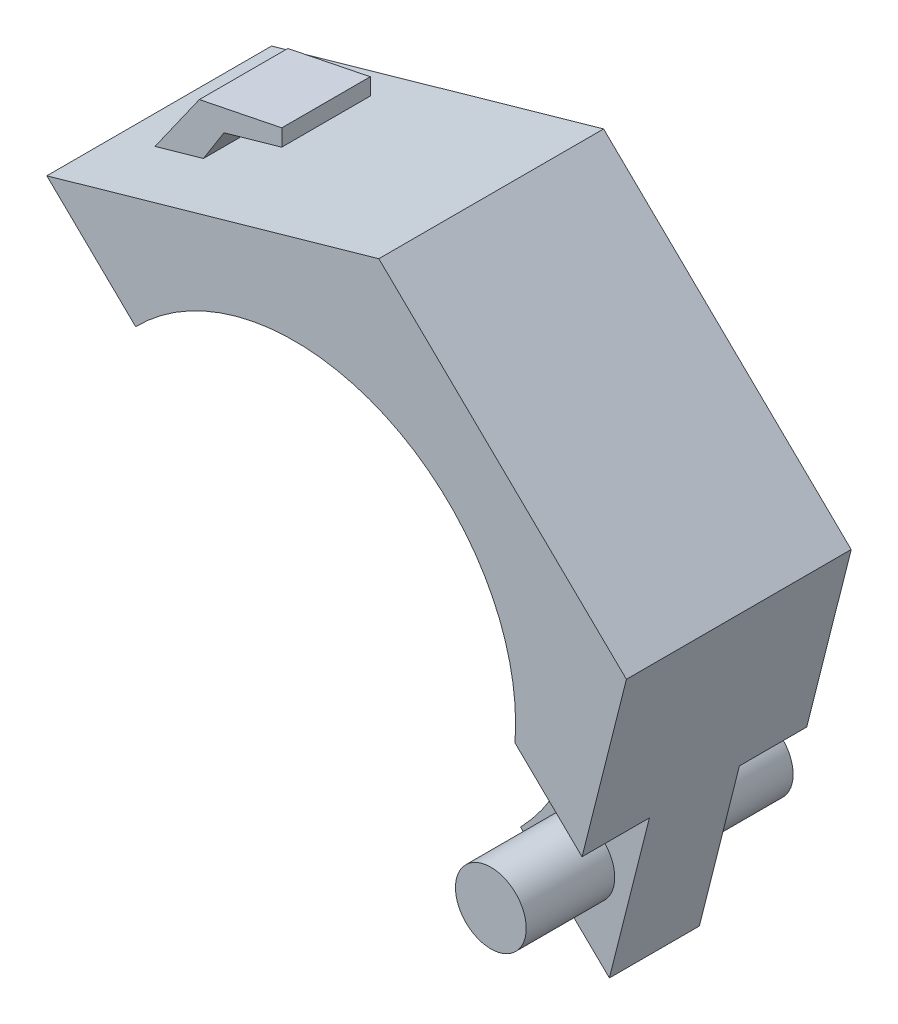
ISO-10303-21;
HEADER;
FILE_DESCRIPTION(('STEP AP214'),'2;1');
FILE_NAME('part.step','',(''),(''),'','','');
FILE_SCHEMA(('AUTOMOTIVE_DESIGN { 1 0 10303 214 1 1 1 1 }'));
ENDSEC;
DATA;
#1=APPLICATION_CONTEXT('core data for automotive mechanical design processes');
#2=APPLICATION_PROTOCOL_DEFINITION('international standard','automotive_design',2000,#1);
#3=PRODUCT_CONTEXT('',#1,'mechanical');
#4=PRODUCT('Part','Part','',(#3));
#5=PRODUCT_RELATED_PRODUCT_CATEGORY('part','',(#4));
#6=PRODUCT_DEFINITION_FORMATION('','',#4);
#7=PRODUCT_DEFINITION_CONTEXT('part definition',#1,'design');
#8=PRODUCT_DEFINITION('design','',#6,#7);
#9=PRODUCT_DEFINITION_SHAPE('','',#8);
#10=(LENGTH_UNIT() NAMED_UNIT(*) SI_UNIT(.MILLI.,.METRE.));
#11=(NAMED_UNIT(*) PLANE_ANGLE_UNIT() SI_UNIT($,.RADIAN.));
#12=(NAMED_UNIT(*) SI_UNIT($,.STERADIAN.) SOLID_ANGLE_UNIT());
#13=UNCERTAINTY_MEASURE_WITH_UNIT(LENGTH_MEASURE(1.E-05),#10,'distance_accuracy_value','');
#14=(GEOMETRIC_REPRESENTATION_CONTEXT(3) GLOBAL_UNCERTAINTY_ASSIGNED_CONTEXT((#13)) GLOBAL_UNIT_ASSIGNED_CONTEXT((#10,
#11,#12)) REPRESENTATION_CONTEXT('',''));
#15=CARTESIAN_POINT('',(0.,0.,0.));
#16=DIRECTION('',(0.,0.,1.));
#17=DIRECTION('',(1.,0.,0.));
#18=AXIS2_PLACEMENT_3D('',#15,#16,#17);
#19=CARTESIAN_POINT('',(-9.21847223963138,32.4926109995357,25.4));
#20=DIRECTION('',(0.272937816875296,-0.962031677295164,0.));
#21=DIRECTION('',(0.962031677295165,0.272937816875296,0.));
#22=AXIS2_PLACEMENT_3D('',#19,#20,#21);
#23=PLANE('',#22);
#24=DIRECTION('',(-0.962031677295164,-0.272937816875296,0.));
#25=VECTOR('',#24,1.);
#26=CARTESIAN_POINT('',(-9.21847223963138,32.4926109995357,0.));
#27=LINE('',#26,#25);
#28=CARTESIAN_POINT('',(9.54114546762431,37.8148984286039,0.));
#29=VERTEX_POINT('',#28);
#30=CARTESIAN_POINT('',(-27.9780899468871,27.1703235704674,0.));
#31=VERTEX_POINT('',#30);
#32=EDGE_CURVE('E228',#29,#31,#27,.T.);
#33=ORIENTED_EDGE('',*,*,#32,.T.);
#34=DIRECTION('',(0.,0.,-1.));
#35=VECTOR('',#34,1.);
#36=CARTESIAN_POINT('',(-27.9780899468871,27.1703235704674,25.4));
#37=LINE('',#36,#35);
#38=CARTESIAN_POINT('',(-27.9780899468871,27.1703235704674,25.4));
#39=VERTEX_POINT('',#38);
#40=EDGE_CURVE('E235',#39,#31,#37,.T.);
#41=ORIENTED_EDGE('',*,*,#40,.F.);
#42=DIRECTION('',(-0.962031677295164,-0.272937816875296,0.));
#43=VECTOR('',#42,1.);
#44=CARTESIAN_POINT('',(-9.21847223963138,32.4926109995357,25.4));
#45=LINE('',#44,#43);
#46=CARTESIAN_POINT('',(9.54114546762431,37.8148984286039,25.4));
#47=VERTEX_POINT('',#46);
#48=EDGE_CURVE('E219',#47,#39,#45,.T.);
#49=ORIENTED_EDGE('',*,*,#48,.F.);
#50=DIRECTION('',(0.,0.,-1.));
#51=VECTOR('',#50,1.);
#52=CARTESIAN_POINT('',(9.54114546762431,37.8148984286039,25.4));
#53=LINE('',#52,#51);
#54=EDGE_CURVE('E238',#47,#29,#53,.T.);
#55=ORIENTED_EDGE('',*,*,#54,.T.);
#56=EDGE_LOOP('',(#33,#41,#49,#55));
#57=FACE_BOUND('',#56,.T.);
#58=DIRECTION('',(-0.962031677295165,-0.272937816875296,0.));
#59=VECTOR('',#58,1.);
#60=CARTESIAN_POINT('',(-17.98380271377,30.0058008245024,7.7));
#61=LINE('',#60,#59);
#62=CARTESIAN_POINT('',(-17.98380271377,30.0058008245024,7.7));
#63=VERTEX_POINT('',#62);
#64=CARTESIAN_POINT('',(-23.4511335696225,28.454665468828,7.7));
#65=VERTEX_POINT('',#64);
#66=EDGE_CURVE('E159',#63,#65,#61,.T.);
#67=ORIENTED_EDGE('',*,*,#66,.F.);
#68=DIRECTION('',(0.,0.,1.));
#69=VECTOR('',#68,1.);
#70=CARTESIAN_POINT('',(-17.98380271377,30.0058008245024,7.7));
#71=LINE('',#70,#69);
#72=CARTESIAN_POINT('',(-17.98380271377,30.0058008245024,17.7));
#73=VERTEX_POINT('',#72);
#74=EDGE_CURVE('E503',#63,#73,#71,.T.);
#75=ORIENTED_EDGE('',*,*,#74,.T.);
#76=DIRECTION('',(-0.962031677295165,-0.272937816875296,0.));
#77=VECTOR('',#76,1.);
#78=CARTESIAN_POINT('',(-17.98380271377,30.0058008245024,17.7));
#79=LINE('',#78,#77);
#80=CARTESIAN_POINT('',(-23.4511335696225,28.454665468828,17.7));
#81=VERTEX_POINT('',#80);
#82=EDGE_CURVE('E172',#73,#81,#79,.T.);
#83=ORIENTED_EDGE('',*,*,#82,.T.);
#84=DIRECTION('',(0.,0.,1.));
#85=VECTOR('',#84,1.);
#86=CARTESIAN_POINT('',(-23.4511335696225,28.454665468828,7.7));
#87=LINE('',#86,#85);
#88=EDGE_CURVE('E54',#65,#81,#87,.T.);
#89=ORIENTED_EDGE('',*,*,#88,.F.);
#90=EDGE_LOOP('',(#67,#75,#83,#89));
#91=FACE_BOUND('',#90,.T.);
#92=ADVANCED_FACE('F39',(#57,#91),#23,.F.);
#93=CARTESIAN_POINT('',(0.,0.,25.4));
#94=DIRECTION('',(0.696674963345317,0.717386921715054,0.));
#95=DIRECTION('',(-0.717386921715054,0.696674963345317,0.));
#96=AXIS2_PLACEMENT_3D('',#93,#94,#95);
#97=PLANE('',#96);
#98=DIRECTION('',(-0.717386921715054,0.696674963345317,0.));
#99=VECTOR('',#98,1.);
#100=CARTESIAN_POINT('',(0.,0.,7.61999999999999));
#101=LINE('',#100,#99);
#102=CARTESIAN_POINT('',(27.9780899468871,-27.1703235704674,7.61999999999999));
#103=VERTEX_POINT('',#102);
#104=CARTESIAN_POINT('',(17.9346730428764,-17.4168740836329,7.61999999999999));
#105=VERTEX_POINT('',#104);
#106=EDGE_CURVE('E186',#103,#105,#101,.T.);
#107=ORIENTED_EDGE('',*,*,#106,.F.);
#108=DIRECTION('',(0.,0.,-1.));
#109=VECTOR('',#108,1.);
#110=CARTESIAN_POINT('',(27.9780899468871,-27.1703235704674,25.4));
#111=LINE('',#110,#109);
#112=CARTESIAN_POINT('',(27.9780899468871,-27.1703235704674,17.78));
#113=VERTEX_POINT('',#112);
#114=EDGE_CURVE('E244',#113,#103,#111,.T.);
#115=ORIENTED_EDGE('',*,*,#114,.F.);
#116=DIRECTION('',(0.717386921715054,-0.696674963345317,0.));
#117=VECTOR('',#116,1.);
#118=CARTESIAN_POINT('',(0.,0.,17.78));
#119=LINE('',#118,#117);
#120=CARTESIAN_POINT('',(17.9346730428764,-17.4168740836329,17.78));
#121=VERTEX_POINT('',#120);
#122=EDGE_CURVE('E205',#121,#113,#119,.T.);
#123=ORIENTED_EDGE('',*,*,#122,.F.);
#124=DIRECTION('',(0.,0.,-1.));
#125=VECTOR('',#124,1.);
#126=CARTESIAN_POINT('',(17.9346730428764,-17.4168740836329,25.4));
#127=LINE('',#126,#125);
#128=EDGE_CURVE('E247',#121,#105,#127,.T.);
#129=ORIENTED_EDGE('',*,*,#128,.T.);
#130=EDGE_LOOP('',(#107,#115,#123,#129));
#131=FACE_BOUND('',#130,.T.);
#132=ADVANCED_FACE('F264',(#131),#97,.F.);
#133=CARTESIAN_POINT('',(0.,0.,25.4));
#134=DIRECTION('',(0.,0.,-1.));
#135=DIRECTION('',(-1.,0.,0.));
#136=AXIS2_PLACEMENT_3D('',#133,#134,#135);
#137=CYLINDRICAL_SURFACE('',#136,25.);
#138=CARTESIAN_POINT('',(0.,0.,0.));
#139=DIRECTION('',(0.,0.,1.));
#140=DIRECTION('',(1.,0.,0.));
#141=AXIS2_PLACEMENT_3D('',#138,#139,#140);
#142=CIRCLE('',#141,25.);
#143=CARTESIAN_POINT('',(24.9292676043889,-1.87925961718109,0.));
#144=VERTEX_POINT('',#143);
#145=CARTESIAN_POINT('',(-17.9346730428764,17.4168740836329,0.));
#146=VERTEX_POINT('',#145);
#147=EDGE_CURVE('E210',#144,#146,#142,.T.);
#148=ORIENTED_EDGE('',*,*,#147,.F.);
#149=DIRECTION('',(0.,0.,-1.));
#150=VECTOR('',#149,1.);
#151=CARTESIAN_POINT('',(24.9292676043889,-1.87925961718109,25.4));
#152=LINE('',#151,#150);
#153=CARTESIAN_POINT('',(24.9292676043889,-1.87925961718109,7.61999999999999));
#154=VERTEX_POINT('',#153);
#155=EDGE_CURVE('E62',#144,#154,#152,.F.);
#156=ORIENTED_EDGE('',*,*,#155,.T.);
#157=CARTESIAN_POINT('',(0.,0.,7.61999999999999));
#158=DIRECTION('',(0.,0.,-1.));
#159=DIRECTION('',(-1.,0.,0.));
#160=AXIS2_PLACEMENT_3D('',#157,#158,#159);
#161=CIRCLE('',#160,25.);
#162=EDGE_CURVE('E188',#154,#105,#161,.T.);
#163=ORIENTED_EDGE('',*,*,#162,.T.);
#164=ORIENTED_EDGE('',*,*,#128,.F.);
#165=CARTESIAN_POINT('',(0.,0.,17.78));
#166=DIRECTION('',(0.,0.,1.));
#167=DIRECTION('',(1.,0.,0.));
#168=AXIS2_PLACEMENT_3D('',#165,#166,#167);
#169=CIRCLE('',#168,25.);
#170=CARTESIAN_POINT('',(24.9292676043889,-1.87925961718109,17.78));
#171=VERTEX_POINT('',#170);
#172=EDGE_CURVE('E207',#121,#171,#169,.T.);
#173=ORIENTED_EDGE('',*,*,#172,.T.);
#174=DIRECTION('',(0.,0.,-1.));
#175=VECTOR('',#174,1.);
#176=CARTESIAN_POINT('',(24.9292676043889,-1.87925961718109,25.4));
#177=LINE('',#176,#175);
#178=CARTESIAN_POINT('',(24.9292676043889,-1.87925961718109,25.4));
#179=VERTEX_POINT('',#178);
#180=EDGE_CURVE('E203',#179,#171,#177,.T.);
#181=ORIENTED_EDGE('',*,*,#180,.F.);
#182=CARTESIAN_POINT('',(0.,0.,25.4));
#183=DIRECTION('',(0.,0.,1.));
#184=DIRECTION('',(1.,0.,0.));
#185=AXIS2_PLACEMENT_3D('',#182,#183,#184);
#186=CIRCLE('',#185,25.);
#187=CARTESIAN_POINT('',(-17.9346730428764,17.4168740836329,25.4));
#188=VERTEX_POINT('',#187);
#189=EDGE_CURVE('E211',#179,#188,#186,.T.);
#190=ORIENTED_EDGE('',*,*,#189,.T.);
#191=DIRECTION('',(0.,0.,-1.));
#192=VECTOR('',#191,1.);
#193=CARTESIAN_POINT('',(-17.9346730428764,17.4168740836329,25.4));
#194=LINE('',#193,#192);
#195=EDGE_CURVE('E218',#188,#146,#194,.T.);
#196=ORIENTED_EDGE('',*,*,#195,.T.);
#197=EDGE_LOOP('',(#148,#156,#163,#164,#173,#181,#190,#196));
#198=FACE_BOUND('',#197,.T.);
#199=ADVANCED_FACE('F41',(#198),#137,.F.);
#200=CARTESIAN_POINT('',(32.7486626806992,-8.26287435616539,25.4));
#201=DIRECTION('',(-0.969612780220614,0.24464475558011,0.));
#202=DIRECTION('',(-0.24464475558011,-0.969612780220614,0.));
#203=AXIS2_PLACEMENT_3D('',#200,#201,#202);
#204=PLANE('',#203);
#205=DIRECTION('',(0.,0.,1.));
#206=VECTOR('',#205,1.);
#207=CARTESIAN_POINT('',(32.5034445671287,-9.23475955474982,25.4));
#208=LINE('',#207,#206);
#209=CARTESIAN_POINT('',(32.5034445671287,-9.23475955474982,0.));
#210=VERTEX_POINT('',#209);
#211=CARTESIAN_POINT('',(32.5034445671287,-9.23475955474982,7.61999999999999));
#212=VERTEX_POINT('',#211);
#213=EDGE_CURVE('E183',#210,#212,#208,.T.);
#214=ORIENTED_EDGE('',*,*,#213,.F.);
#215=DIRECTION('',(0.24464475558011,0.969612780220614,0.));
#216=VECTOR('',#215,1.);
#217=CARTESIAN_POINT('',(32.7486626806992,-8.26287435616539,0.));
#218=LINE('',#217,#216);
#219=CARTESIAN_POINT('',(37.5192354145114,10.6445748581366,0.));
#220=VERTEX_POINT('',#219);
#221=EDGE_CURVE('E225',#210,#220,#218,.T.);
#222=ORIENTED_EDGE('',*,*,#221,.T.);
#223=DIRECTION('',(0.,0.,-1.));
#224=VECTOR('',#223,1.);
#225=CARTESIAN_POINT('',(37.5192354145114,10.6445748581366,25.4));
#226=LINE('',#225,#224);
#227=CARTESIAN_POINT('',(37.5192354145114,10.6445748581366,25.4));
#228=VERTEX_POINT('',#227);
#229=EDGE_CURVE('E241',#228,#220,#226,.T.);
#230=ORIENTED_EDGE('',*,*,#229,.F.);
#231=DIRECTION('',(0.24464475558011,0.969612780220614,0.));
#232=VECTOR('',#231,1.);
#233=CARTESIAN_POINT('',(32.7486626806992,-8.26287435616539,25.4));
#234=LINE('',#233,#232);
#235=CARTESIAN_POINT('',(32.5034445671287,-9.23475955474982,25.4));
#236=VERTEX_POINT('',#235);
#237=EDGE_CURVE('E213',#236,#228,#234,.T.);
#238=ORIENTED_EDGE('',*,*,#237,.F.);
#239=DIRECTION('',(0.,0.,-1.));
#240=VECTOR('',#239,1.);
#241=CARTESIAN_POINT('',(32.5034445671287,-9.23475955474982,25.4));
#242=LINE('',#241,#240);
#243=CARTESIAN_POINT('',(32.5034445671287,-9.23475955474982,17.78));
#244=VERTEX_POINT('',#243);
#245=EDGE_CURVE('E200',#236,#244,#242,.T.);
#246=ORIENTED_EDGE('',*,*,#245,.T.);
#247=DIRECTION('',(0.24464475558011,0.969612780220614,0.));
#248=VECTOR('',#247,1.);
#249=CARTESIAN_POINT('',(32.7486626806992,-8.26287435616539,17.78));
#250=LINE('',#249,#248);
#251=EDGE_CURVE('E252',#113,#244,#250,.T.);
#252=ORIENTED_EDGE('',*,*,#251,.F.);
#253=ORIENTED_EDGE('',*,*,#114,.T.);
#254=DIRECTION('',(-0.24464475558011,-0.969612780220614,0.));
#255=VECTOR('',#254,1.);
#256=CARTESIAN_POINT('',(32.7486626806992,-8.26287435616539,7.61999999999999));
#257=LINE('',#256,#255);
#258=EDGE_CURVE('E47',#212,#103,#257,.T.);
#259=ORIENTED_EDGE('',*,*,#258,.F.);
#260=EDGE_LOOP('',(#214,#222,#230,#238,#246,#252,#253,#259));
#261=FACE_BOUND('',#260,.T.);
#262=ADVANCED_FACE('F268',(#261),#204,.F.);
#263=CARTESIAN_POINT('',(0.,0.,0.));
#264=DIRECTION('',(0.,0.,1.));
#265=DIRECTION('',(1.,0.,0.));
#266=AXIS2_PLACEMENT_3D('',#263,#264,#265);
#267=PLANE('',#266);
#268=DIRECTION('',(0.717386921715054,-0.696674963345318,0.));
#269=VECTOR('',#268,1.);
#270=CARTESIAN_POINT('',(11.1603429995879,11.4921369806569,0.));
#271=LINE('',#270,#269);
#272=EDGE_CURVE('E254',#144,#210,#271,.T.);
#273=ORIENTED_EDGE('',*,*,#272,.F.);
#274=ORIENTED_EDGE('',*,*,#147,.T.);
#275=DIRECTION('',(0.717386921715054,-0.696674963345317,0.));
#276=VECTOR('',#275,1.);
#277=CARTESIAN_POINT('',(0.,0.,0.));
#278=LINE('',#277,#276);
#279=EDGE_CURVE('E214',#31,#146,#278,.T.);
#280=ORIENTED_EDGE('',*,*,#279,.F.);
#281=ORIENTED_EDGE('',*,*,#32,.F.);
#282=DIRECTION('',(-0.717386921715054,0.696674963345317,0.));
#283=VECTOR('',#282,1.);
#284=CARTESIAN_POINT('',(23.5301904410679,24.2297366433702,0.));
#285=LINE('',#284,#283);
#286=EDGE_CURVE('E230',#220,#29,#285,.T.);
#287=ORIENTED_EDGE('',*,*,#286,.F.);
#288=ORIENTED_EDGE('',*,*,#221,.F.);
#289=EDGE_LOOP('',(#273,#274,#280,#281,#287,#288));
#290=FACE_BOUND('',#289,.T.);
#291=ADVANCED_FACE('F290',(#290),#267,.F.);
#292=CARTESIAN_POINT('',(23.5301904410679,24.2297366433702,25.4));
#293=DIRECTION('',(-0.696674963345317,-0.717386921715054,0.));
#294=DIRECTION('',(0.717386921715054,-0.696674963345317,0.));
#295=AXIS2_PLACEMENT_3D('',#292,#293,#294);
#296=PLANE('',#295);
#297=ORIENTED_EDGE('',*,*,#286,.T.);
#298=ORIENTED_EDGE('',*,*,#54,.F.);
#299=DIRECTION('',(-0.717386921715054,0.696674963345317,0.));
#300=VECTOR('',#299,1.);
#301=CARTESIAN_POINT('',(23.5301904410679,24.2297366433702,25.4));
#302=LINE('',#301,#300);
#303=EDGE_CURVE('E221',#228,#47,#302,.T.);
#304=ORIENTED_EDGE('',*,*,#303,.F.);
#305=ORIENTED_EDGE('',*,*,#229,.T.);
#306=EDGE_LOOP('',(#297,#298,#304,#305));
#307=FACE_BOUND('',#306,.T.);
#308=ADVANCED_FACE('F298',(#307),#296,.F.);
#309=ORIENTED_EDGE('',*,*,#279,.T.);
#310=ORIENTED_EDGE('',*,*,#195,.F.);
#311=DIRECTION('',(0.717386921715054,-0.696674963345317,0.));
#312=VECTOR('',#311,1.);
#313=CARTESIAN_POINT('',(0.,0.,25.4));
#314=LINE('',#313,#312);
#315=EDGE_CURVE('E215',#39,#188,#314,.T.);
#316=ORIENTED_EDGE('',*,*,#315,.F.);
#317=ORIENTED_EDGE('',*,*,#40,.T.);
#318=EDGE_LOOP('',(#309,#310,#316,#317));
#319=FACE_BOUND('',#318,.T.);
#320=ADVANCED_FACE('F287',(#319),#97,.F.);
#321=CARTESIAN_POINT('',(0.,0.,25.4));
#322=DIRECTION('',(0.,0.,1.));
#323=DIRECTION('',(1.,0.,0.));
#324=AXIS2_PLACEMENT_3D('',#321,#322,#323);
#325=PLANE('',#324);
#326=DIRECTION('',(-0.717386921715054,0.696674963345318,0.));
#327=VECTOR('',#326,1.);
#328=CARTESIAN_POINT('',(11.1603429995879,11.4921369806569,25.4));
#329=LINE('',#328,#327);
#330=EDGE_CURVE('E250',#236,#179,#329,.T.);
#331=ORIENTED_EDGE('',*,*,#330,.F.);
#332=ORIENTED_EDGE('',*,*,#237,.T.);
#333=ORIENTED_EDGE('',*,*,#303,.T.);
#334=ORIENTED_EDGE('',*,*,#48,.T.);
#335=ORIENTED_EDGE('',*,*,#315,.T.);
#336=ORIENTED_EDGE('',*,*,#189,.F.);
#337=EDGE_LOOP('',(#331,#332,#333,#334,#335,#336));
#338=FACE_BOUND('',#337,.T.);
#339=ADVANCED_FACE('F281',(#338),#325,.T.);
#340=CARTESIAN_POINT('',(21.4194119209083,1.52926165024091,17.78));
#341=DIRECTION('',(0.696674963345318,0.717386921715054,0.));
#342=DIRECTION('',(-0.717386921715054,0.696674963345318,0.));
#343=AXIS2_PLACEMENT_3D('',#340,#341,#342);
#344=PLANE('',#343);
#345=ORIENTED_EDGE('',*,*,#180,.T.);
#346=DIRECTION('',(-0.717386921715054,0.696674963345318,0.));
#347=VECTOR('',#346,1.);
#348=CARTESIAN_POINT('',(21.4194119209083,1.52926165024091,17.78));
#349=LINE('',#348,#347);
#350=EDGE_CURVE('E195',#244,#171,#349,.T.);
#351=ORIENTED_EDGE('',*,*,#350,.F.);
#352=ORIENTED_EDGE('',*,*,#245,.F.);
#353=ORIENTED_EDGE('',*,*,#330,.T.);
#354=EDGE_LOOP('',(#345,#351,#352,#353));
#355=FACE_BOUND('',#354,.T.);
#356=ADVANCED_FACE('F274',(#355),#344,.F.);
#357=CARTESIAN_POINT('',(0.,0.,17.78));
#358=DIRECTION('',(0.,0.,1.));
#359=DIRECTION('',(1.,0.,0.));
#360=AXIS2_PLACEMENT_3D('',#357,#358,#359);
#361=PLANE('',#360);
#362=CARTESIAN_POINT('',(24.578895169242,-17.0231040283954,17.78));
#363=DIRECTION('',(0.,0.,1.));
#364=DIRECTION('',(1.,0.,0.));
#365=AXIS2_PLACEMENT_3D('',#362,#363,#364);
#366=CIRCLE('',#365,4.);
#367=CARTESIAN_POINT('',(28.578895169242,-17.0231040283954,17.78));
#368=VERTEX_POINT('',#367);
#369=EDGE_CURVE('E191',#368,#368,#366,.T.);
#370=ORIENTED_EDGE('',*,*,#369,.F.);
#371=EDGE_LOOP('',(#370));
#372=FACE_BOUND('',#371,.T.);
#373=ORIENTED_EDGE('',*,*,#122,.T.);
#374=ORIENTED_EDGE('',*,*,#251,.T.);
#375=ORIENTED_EDGE('',*,*,#350,.T.);
#376=ORIENTED_EDGE('',*,*,#172,.F.);
#377=EDGE_LOOP('',(#373,#374,#375,#376));
#378=FACE_BOUND('',#377,.T.);
#379=ADVANCED_FACE('F272',(#372,#378),#361,.T.);
#380=CARTESIAN_POINT('',(24.578895169242,-17.0231040283954,27.78));
#381=DIRECTION('',(0.,0.,-1.));
#382=DIRECTION('',(-1.,0.,0.));
#383=AXIS2_PLACEMENT_3D('',#380,#381,#382);
#384=CYLINDRICAL_SURFACE('',#383,4.);
#385=CARTESIAN_POINT('',(24.578895169242,-17.0231040283954,27.78));
#386=DIRECTION('',(0.,0.,1.));
#387=DIRECTION('',(1.,0.,0.));
#388=AXIS2_PLACEMENT_3D('',#385,#386,#387);
#389=CIRCLE('',#388,4.);
#390=CARTESIAN_POINT('',(28.578895169242,-17.0231040283954,27.78));
#391=VERTEX_POINT('',#390);
#392=EDGE_CURVE('E192',#391,#391,#389,.T.);
#393=ORIENTED_EDGE('',*,*,#392,.F.);
#394=EDGE_LOOP('',(#393));
#395=FACE_BOUND('',#394,.T.);
#396=ORIENTED_EDGE('',*,*,#369,.T.);
#397=EDGE_LOOP('',(#396));
#398=FACE_BOUND('',#397,.T.);
#399=ADVANCED_FACE('F332',(#395,#398),#384,.T.);
#400=CARTESIAN_POINT('',(24.578895169242,-17.0231040283954,27.78));
#401=DIRECTION('',(0.,0.,1.));
#402=DIRECTION('',(1.,0.,0.));
#403=AXIS2_PLACEMENT_3D('',#400,#401,#402);
#404=PLANE('',#403);
#405=ORIENTED_EDGE('',*,*,#392,.T.);
#406=EDGE_LOOP('',(#405));
#407=FACE_BOUND('',#406,.T.);
#408=ADVANCED_FACE('F327',(#407),#404,.T.);
#409=CARTESIAN_POINT('',(21.4194119209083,1.52926165024091,7.61999999999999));
#410=DIRECTION('',(-0.696674963345318,-0.717386921715054,0.));
#411=DIRECTION('',(0.717386921715054,-0.696674963345318,0.));
#412=AXIS2_PLACEMENT_3D('',#409,#410,#411);
#413=PLANE('',#412);
#414=ORIENTED_EDGE('',*,*,#272,.T.);
#415=ORIENTED_EDGE('',*,*,#213,.T.);
#416=DIRECTION('',(-0.717386921715054,0.696674963345318,0.));
#417=VECTOR('',#416,1.);
#418=CARTESIAN_POINT('',(21.4194119209083,1.52926165024091,7.61999999999999));
#419=LINE('',#418,#417);
#420=EDGE_CURVE('E176',#212,#154,#419,.T.);
#421=ORIENTED_EDGE('',*,*,#420,.T.);
#422=ORIENTED_EDGE('',*,*,#155,.F.);
#423=EDGE_LOOP('',(#414,#415,#421,#422));
#424=FACE_BOUND('',#423,.T.);
#425=ADVANCED_FACE('F294',(#424),#413,.T.);
#426=CARTESIAN_POINT('',(0.,0.,7.61999999999999));
#427=DIRECTION('',(0.,0.,-1.));
#428=DIRECTION('',(1.,0.,0.));
#429=AXIS2_PLACEMENT_3D('',#426,#427,#428);
#430=PLANE('',#429);
#431=CARTESIAN_POINT('',(24.578895169242,-17.0231040283954,7.61999999999999));
#432=DIRECTION('',(0.,0.,-1.));
#433=DIRECTION('',(-1.,0.,0.));
#434=AXIS2_PLACEMENT_3D('',#431,#432,#433);
#435=CIRCLE('',#434,4.);
#436=CARTESIAN_POINT('',(20.578895169242,-17.0231040283954,7.61999999999999));
#437=VERTEX_POINT('',#436);
#438=EDGE_CURVE('E11',#437,#437,#435,.T.);
#439=ORIENTED_EDGE('',*,*,#438,.F.);
#440=EDGE_LOOP('',(#439));
#441=FACE_BOUND('',#440,.T.);
#442=ORIENTED_EDGE('',*,*,#420,.F.);
#443=ORIENTED_EDGE('',*,*,#258,.T.);
#444=ORIENTED_EDGE('',*,*,#106,.T.);
#445=ORIENTED_EDGE('',*,*,#162,.F.);
#446=EDGE_LOOP('',(#442,#443,#444,#445));
#447=FACE_BOUND('',#446,.T.);
#448=ADVANCED_FACE('F259',(#441,#447),#430,.T.);
#449=CARTESIAN_POINT('',(24.578895169242,-17.0231040283954,-2.38000000000001));
#450=DIRECTION('',(0.,0.,1.));
#451=DIRECTION('',(1.,0.,0.));
#452=AXIS2_PLACEMENT_3D('',#449,#450,#451);
#453=CYLINDRICAL_SURFACE('',#452,4.);
#454=CARTESIAN_POINT('',(24.578895169242,-17.0231040283954,-2.38000000000001));
#455=DIRECTION('',(0.,0.,1.));
#456=DIRECTION('',(1.,0.,0.));
#457=AXIS2_PLACEMENT_3D('',#454,#455,#456);
#458=CIRCLE('',#457,4.);
#459=CARTESIAN_POINT('',(28.578895169242,-17.0231040283954,-2.38000000000001));
#460=VERTEX_POINT('',#459);
#461=EDGE_CURVE('E173',#460,#460,#458,.T.);
#462=ORIENTED_EDGE('',*,*,#461,.T.);
#463=EDGE_LOOP('',(#462));
#464=FACE_BOUND('',#463,.T.);
#465=ORIENTED_EDGE('',*,*,#438,.T.);
#466=EDGE_LOOP('',(#465));
#467=FACE_BOUND('',#466,.T.);
#468=ADVANCED_FACE('F404',(#464,#467),#453,.T.);
#469=CARTESIAN_POINT('',(24.578895169242,-17.0231040283954,-2.38000000000001));
#470=DIRECTION('',(0.,0.,-1.));
#471=DIRECTION('',(1.,0.,0.));
#472=AXIS2_PLACEMENT_3D('',#469,#470,#471);
#473=PLANE('',#472);
#474=ORIENTED_EDGE('',*,*,#461,.F.);
#475=EDGE_LOOP('',(#474));
#476=FACE_BOUND('',#475,.T.);
#477=ADVANCED_FACE('F414',(#476),#473,.T.);
#478=CARTESIAN_POINT('',(-23.4511335696225,28.454665468828,7.7));
#479=DIRECTION('',(0.816888051454011,-0.576796247726759,0.));
#480=DIRECTION('',(0.576796247726759,0.816888051454011,0.));
#481=AXIS2_PLACEMENT_3D('',#478,#479,#480);
#482=PLANE('',#481);
#483=DIRECTION('',(0.576796247726759,0.816888051454011,0.));
#484=VECTOR('',#483,1.);
#485=CARTESIAN_POINT('',(-23.4511335696225,28.454665468828,17.7));
#486=LINE('',#485,#484);
#487=CARTESIAN_POINT('',(-18.4428279641781,35.5476814571285,17.7));
#488=VERTEX_POINT('',#487);
#489=EDGE_CURVE('E501',#81,#488,#486,.T.);
#490=ORIENTED_EDGE('',*,*,#489,.T.);
#491=DIRECTION('',(0.,0.,1.));
#492=VECTOR('',#491,1.);
#493=CARTESIAN_POINT('',(-18.4428279641781,35.5476814571285,7.7));
#494=LINE('',#493,#492);
#495=CARTESIAN_POINT('',(-18.4428279641781,35.5476814571285,7.7));
#496=VERTEX_POINT('',#495);
#497=EDGE_CURVE('E155',#496,#488,#494,.T.);
#498=ORIENTED_EDGE('',*,*,#497,.F.);
#499=DIRECTION('',(0.576796247726759,0.816888051454011,0.));
#500=VECTOR('',#499,1.);
#501=CARTESIAN_POINT('',(-23.4511335696225,28.454665468828,7.7));
#502=LINE('',#501,#500);
#503=EDGE_CURVE('E151',#65,#496,#502,.T.);
#504=ORIENTED_EDGE('',*,*,#503,.F.);
#505=ORIENTED_EDGE('',*,*,#88,.T.);
#506=EDGE_LOOP('',(#490,#498,#504,#505));
#507=FACE_BOUND('',#506,.T.);
#508=ADVANCED_FACE('F153',(#507),#482,.F.);
#509=CARTESIAN_POINT('',(-18.4428279641781,35.5476814571285,7.7));
#510=DIRECTION('',(0.198942848691443,-0.980011093281364,0.));
#511=DIRECTION('',(0.980011093281364,0.198942848691443,0.));
#512=AXIS2_PLACEMENT_3D('',#509,#510,#511);
#513=PLANE('',#512);
#514=DIRECTION('',(0.980011093281364,0.198942848691443,0.));
#515=VECTOR('',#514,1.);
#516=CARTESIAN_POINT('',(-18.4428279641781,35.5476814571285,17.7));
#517=LINE('',#516,#515);
#518=CARTESIAN_POINT('',(-9.12578876916258,37.4390460871144,17.7));
#519=VERTEX_POINT('',#518);
#520=EDGE_CURVE('E522',#488,#519,#517,.T.);
#521=ORIENTED_EDGE('',*,*,#520,.T.);
#522=DIRECTION('',(0.,0.,1.));
#523=VECTOR('',#522,1.);
#524=CARTESIAN_POINT('',(-9.12578876916258,37.4390460871144,7.7));
#525=LINE('',#524,#523);
#526=CARTESIAN_POINT('',(-9.12578876916258,37.4390460871144,7.7));
#527=VERTEX_POINT('',#526);
#528=EDGE_CURVE('E178',#527,#519,#525,.T.);
#529=ORIENTED_EDGE('',*,*,#528,.F.);
#530=DIRECTION('',(0.980011093281364,0.198942848691443,0.));
#531=VECTOR('',#530,1.);
#532=CARTESIAN_POINT('',(-18.4428279641781,35.5476814571285,7.7));
#533=LINE('',#532,#531);
#534=EDGE_CURVE('E158',#496,#527,#533,.T.);
#535=ORIENTED_EDGE('',*,*,#534,.F.);
#536=ORIENTED_EDGE('',*,*,#497,.T.);
#537=EDGE_LOOP('',(#521,#529,#535,#536));
#538=FACE_BOUND('',#537,.T.);
#539=ADVANCED_FACE('F437',(#538),#513,.F.);
#540=CARTESIAN_POINT('',(-9.12578876916258,37.4390460871144,7.7));
#541=DIRECTION('',(-1.,0.,0.));
#542=DIRECTION('',(0.,0.,1.));
#543=AXIS2_PLACEMENT_3D('',#540,#541,#542);
#544=PLANE('',#543);
#545=DIRECTION('',(0.,-1.,0.));
#546=VECTOR('',#545,1.);
#547=CARTESIAN_POINT('',(-9.12578876916258,37.4390460871144,17.7));
#548=LINE('',#547,#546);
#549=CARTESIAN_POINT('',(-9.12578876916258,35.5476814571285,17.7));
#550=VERTEX_POINT('',#549);
#551=EDGE_CURVE('E520',#519,#550,#548,.T.);
#552=ORIENTED_EDGE('',*,*,#551,.T.);
#553=DIRECTION('',(0.,0.,1.));
#554=VECTOR('',#553,1.);
#555=CARTESIAN_POINT('',(-9.12578876916258,35.5476814571285,7.7));
#556=LINE('',#555,#554);
#557=CARTESIAN_POINT('',(-9.12578876916258,35.5476814571285,7.7));
#558=VERTEX_POINT('',#557);
#559=EDGE_CURVE('E507',#558,#550,#556,.T.);
#560=ORIENTED_EDGE('',*,*,#559,.F.);
#561=DIRECTION('',(0.,-1.,0.));
#562=VECTOR('',#561,1.);
#563=CARTESIAN_POINT('',(-9.12578876916258,37.4390460871144,7.7));
#564=LINE('',#563,#562);
#565=EDGE_CURVE('E521',#527,#558,#564,.T.);
#566=ORIENTED_EDGE('',*,*,#565,.F.);
#567=ORIENTED_EDGE('',*,*,#528,.T.);
#568=EDGE_LOOP('',(#552,#560,#566,#567));
#569=FACE_BOUND('',#568,.T.);
#570=ADVANCED_FACE('F446',(#569),#544,.F.);
#571=CARTESIAN_POINT('',(-9.12578876916258,35.5476814571285,7.7));
#572=DIRECTION('',(-0.272937816875295,0.962031677295165,0.));
#573=DIRECTION('',(-0.962031677295165,-0.272937816875295,0.));
#574=AXIS2_PLACEMENT_3D('',#571,#572,#573);
#575=PLANE('',#574);
#576=DIRECTION('',(-0.962031677295165,-0.272937816875295,0.));
#577=VECTOR('',#576,1.);
#578=CARTESIAN_POINT('',(-9.12578876916258,35.5476814571285,17.7));
#579=LINE('',#578,#577);
#580=CARTESIAN_POINT('',(-15.649252306192,33.6969109073807,17.7));
#581=VERTEX_POINT('',#580);
#582=EDGE_CURVE('E523',#550,#581,#579,.T.);
#583=ORIENTED_EDGE('',*,*,#582,.T.);
#584=DIRECTION('',(0.,0.,1.));
#585=VECTOR('',#584,1.);
#586=CARTESIAN_POINT('',(-15.649252306192,33.6969109073807,7.7));
#587=LINE('',#586,#585);
#588=CARTESIAN_POINT('',(-15.649252306192,33.6969109073807,7.7));
#589=VERTEX_POINT('',#588);
#590=EDGE_CURVE('E504',#589,#581,#587,.T.);
#591=ORIENTED_EDGE('',*,*,#590,.F.);
#592=DIRECTION('',(-0.962031677295165,-0.272937816875295,0.));
#593=VECTOR('',#592,1.);
#594=CARTESIAN_POINT('',(-9.12578876916258,35.5476814571285,7.7));
#595=LINE('',#594,#593);
#596=EDGE_CURVE('E509',#558,#589,#595,.T.);
#597=ORIENTED_EDGE('',*,*,#596,.F.);
#598=ORIENTED_EDGE('',*,*,#559,.T.);
#599=EDGE_LOOP('',(#583,#591,#597,#598));
#600=FACE_BOUND('',#599,.T.);
#601=ADVANCED_FACE('F456',(#600),#575,.F.);
#602=CARTESIAN_POINT('',(-15.649252306192,33.6969109073807,7.7));
#603=DIRECTION('',(-0.845145212518122,0.534536780547137,0.));
#604=DIRECTION('',(-0.534536780547137,-0.845145212518122,0.));
#605=AXIS2_PLACEMENT_3D('',#602,#603,#604);
#606=PLANE('',#605);
#607=DIRECTION('',(-0.534536780547137,-0.845145212518122,0.));
#608=VECTOR('',#607,1.);
#609=CARTESIAN_POINT('',(-15.649252306192,33.6969109073807,17.7));
#610=LINE('',#609,#608);
#611=EDGE_CURVE('E168',#581,#73,#610,.T.);
#612=ORIENTED_EDGE('',*,*,#611,.T.);
#613=ORIENTED_EDGE('',*,*,#74,.F.);
#614=DIRECTION('',(-0.534536780547137,-0.845145212518122,0.));
#615=VECTOR('',#614,1.);
#616=CARTESIAN_POINT('',(-15.649252306192,33.6969109073807,7.7));
#617=LINE('',#616,#615);
#618=EDGE_CURVE('E164',#589,#63,#617,.T.);
#619=ORIENTED_EDGE('',*,*,#618,.F.);
#620=ORIENTED_EDGE('',*,*,#590,.T.);
#621=EDGE_LOOP('',(#612,#613,#619,#620));
#622=FACE_BOUND('',#621,.T.);
#623=ADVANCED_FACE('F466',(#622),#606,.F.);
#624=CARTESIAN_POINT('',(0.,0.,7.7));
#625=DIRECTION('',(0.,0.,1.));
#626=DIRECTION('',(1.,0.,0.));
#627=AXIS2_PLACEMENT_3D('',#624,#625,#626);
#628=PLANE('',#627);
#629=ORIENTED_EDGE('',*,*,#66,.T.);
#630=ORIENTED_EDGE('',*,*,#503,.T.);
#631=ORIENTED_EDGE('',*,*,#534,.T.);
#632=ORIENTED_EDGE('',*,*,#565,.T.);
#633=ORIENTED_EDGE('',*,*,#596,.T.);
#634=ORIENTED_EDGE('',*,*,#618,.T.);
#635=EDGE_LOOP('',(#629,#630,#631,#632,#633,#634));
#636=FACE_BOUND('',#635,.T.);
#637=ADVANCED_FACE('F162',(#636),#628,.F.);
#638=CARTESIAN_POINT('',(0.,0.,17.7));
#639=DIRECTION('',(0.,0.,1.));
#640=DIRECTION('',(1.,0.,0.));
#641=AXIS2_PLACEMENT_3D('',#638,#639,#640);
#642=PLANE('',#641);
#643=ORIENTED_EDGE('',*,*,#82,.F.);
#644=ORIENTED_EDGE('',*,*,#611,.F.);
#645=ORIENTED_EDGE('',*,*,#582,.F.);
#646=ORIENTED_EDGE('',*,*,#551,.F.);
#647=ORIENTED_EDGE('',*,*,#520,.F.);
#648=ORIENTED_EDGE('',*,*,#489,.F.);
#649=EDGE_LOOP('',(#643,#644,#645,#646,#647,#648));
#650=FACE_BOUND('',#649,.T.);
#651=ADVANCED_FACE('F485',(#650),#642,.T.);
#652=CLOSED_SHELL('',(#92,#132,#199,#262,#291,#308,#320,#339,#356,#379,#399,#408,#425,#448,#468,
#477,#508,#539,#570,#601,#623,#637,#651));
#653=MANIFOLD_SOLID_BREP('B2',#652);
#654=ADVANCED_BREP_SHAPE_REPRESENTATION('',(#18,#653),#14);
#655=SHAPE_DEFINITION_REPRESENTATION(#9,#654);
ENDSEC;
END-ISO-10303-21;
